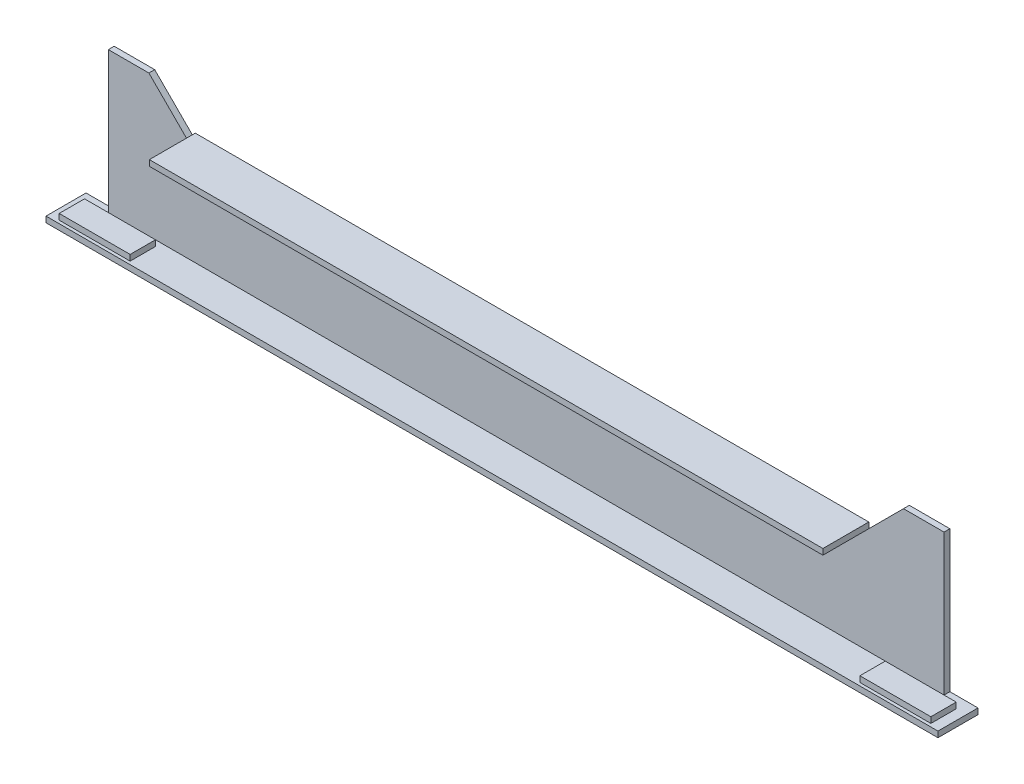
ISO-10303-21;
HEADER;
FILE_DESCRIPTION(('STEP AP214'),'2;1');
FILE_NAME('part.step','',(''),(''),'','','');
FILE_SCHEMA(('AUTOMOTIVE_DESIGN { 1 0 10303 214 1 1 1 1 }'));
ENDSEC;
DATA;
#1=APPLICATION_CONTEXT('core data for automotive mechanical design processes');
#2=APPLICATION_PROTOCOL_DEFINITION('international standard','automotive_design',2000,#1);
#3=PRODUCT_CONTEXT('',#1,'mechanical');
#4=PRODUCT('Part','Part','',(#3));
#5=PRODUCT_RELATED_PRODUCT_CATEGORY('part','',(#4));
#6=PRODUCT_DEFINITION_FORMATION('','',#4);
#7=PRODUCT_DEFINITION_CONTEXT('part definition',#1,'design');
#8=PRODUCT_DEFINITION('design','',#6,#7);
#9=PRODUCT_DEFINITION_SHAPE('','',#8);
#10=(LENGTH_UNIT() NAMED_UNIT(*) SI_UNIT(.MILLI.,.METRE.));
#11=(NAMED_UNIT(*) PLANE_ANGLE_UNIT() SI_UNIT($,.RADIAN.));
#12=(NAMED_UNIT(*) SI_UNIT($,.STERADIAN.) SOLID_ANGLE_UNIT());
#13=UNCERTAINTY_MEASURE_WITH_UNIT(LENGTH_MEASURE(1.E-05),#10,'distance_accuracy_value','');
#14=(GEOMETRIC_REPRESENTATION_CONTEXT(3) GLOBAL_UNCERTAINTY_ASSIGNED_CONTEXT((#13)) GLOBAL_UNIT_ASSIGNED_CONTEXT((#10,
#11,#12)) REPRESENTATION_CONTEXT('',''));
#15=CARTESIAN_POINT('',(0.,0.,0.));
#16=DIRECTION('',(0.,0.,1.));
#17=DIRECTION('',(1.,0.,0.));
#18=AXIS2_PLACEMENT_3D('',#15,#16,#17);
#19=CARTESIAN_POINT('',(880.,-139.25,79.));
#20=DIRECTION('',(0.,-1.,0.));
#21=DIRECTION('',(1.,0.,0.));
#22=AXIS2_PLACEMENT_3D('',#19,#20,#21);
#23=PLANE('',#22);
#24=DIRECTION('',(0.,0.,1.));
#25=VECTOR('',#24,1.);
#26=CARTESIAN_POINT('',(720.,-139.25,23.));
#27=LINE('',#26,#25);
#28=CARTESIAN_POINT('',(720.,-139.25,23.));
#29=VERTEX_POINT('',#28);
#30=CARTESIAN_POINT('',(720.,-139.25,73.));
#31=VERTEX_POINT('',#30);
#32=EDGE_CURVE('E214',#29,#31,#27,.T.);
#33=ORIENTED_EDGE('',*,*,#32,.F.);
#34=DIRECTION('',(-1.,0.,0.));
#35=VECTOR('',#34,1.);
#36=CARTESIAN_POINT('',(720.,-139.25,23.));
#37=LINE('',#36,#35);
#38=CARTESIAN_POINT('',(860.,-139.25,23.));
#39=VERTEX_POINT('',#38);
#40=EDGE_CURVE('E227',#39,#29,#37,.T.);
#41=ORIENTED_EDGE('',*,*,#40,.F.);
#42=DIRECTION('',(0.,0.,-1.));
#43=VECTOR('',#42,1.);
#44=CARTESIAN_POINT('',(860.,-139.25,23.));
#45=LINE('',#44,#43);
#46=CARTESIAN_POINT('',(860.,-139.25,73.));
#47=VERTEX_POINT('',#46);
#48=EDGE_CURVE('E236',#47,#39,#45,.T.);
#49=ORIENTED_EDGE('',*,*,#48,.F.);
#50=DIRECTION('',(1.,0.,0.));
#51=VECTOR('',#50,1.);
#52=CARTESIAN_POINT('',(720.,-139.25,73.));
#53=LINE('',#52,#51);
#54=EDGE_CURVE('E217',#31,#47,#53,.T.);
#55=ORIENTED_EDGE('',*,*,#54,.F.);
#56=EDGE_LOOP('',(#33,#41,#49,#55));
#57=FACE_BOUND('',#56,.T.);
#58=DIRECTION('',(0.,0.,-1.));
#59=VECTOR('',#58,1.);
#60=CARTESIAN_POINT('',(824.5,-139.25,11.5));
#61=LINE('',#60,#59);
#62=CARTESIAN_POINT('',(824.5,-139.25,11.5));
#63=VERTEX_POINT('',#62);
#64=CARTESIAN_POINT('',(824.5,-139.25,0.));
#65=VERTEX_POINT('',#64);
#66=EDGE_CURVE('E45',#63,#65,#61,.T.);
#67=ORIENTED_EDGE('',*,*,#66,.F.);
#68=DIRECTION('',(1.,0.,0.));
#69=VECTOR('',#68,1.);
#70=CARTESIAN_POINT('',(-824.5,-139.25,11.5));
#71=LINE('',#70,#69);
#72=CARTESIAN_POINT('',(-824.5,-139.25,11.5));
#73=VERTEX_POINT('',#72);
#74=EDGE_CURVE('E381',#73,#63,#71,.T.);
#75=ORIENTED_EDGE('',*,*,#74,.F.);
#76=DIRECTION('',(0.,0.,-1.));
#77=VECTOR('',#76,1.);
#78=CARTESIAN_POINT('',(-824.5,-139.25,11.5));
#79=LINE('',#78,#77);
#80=CARTESIAN_POINT('',(-824.5,-139.25,0.));
#81=VERTEX_POINT('',#80);
#82=EDGE_CURVE('E11',#73,#81,#79,.T.);
#83=ORIENTED_EDGE('',*,*,#82,.T.);
#84=DIRECTION('',(-1.,0.,0.));
#85=VECTOR('',#84,1.);
#86=CARTESIAN_POINT('',(880.,-139.25,0.));
#87=LINE('',#86,#85);
#88=CARTESIAN_POINT('',(-880.,-139.25,0.));
#89=VERTEX_POINT('',#88);
#90=EDGE_CURVE('E255',#81,#89,#87,.T.);
#91=ORIENTED_EDGE('',*,*,#90,.T.);
#92=DIRECTION('',(0.,0.,-1.));
#93=VECTOR('',#92,1.);
#94=CARTESIAN_POINT('',(-880.,-139.25,79.));
#95=LINE('',#94,#93);
#96=CARTESIAN_POINT('',(-880.,-139.25,79.));
#97=VERTEX_POINT('',#96);
#98=EDGE_CURVE('E270',#97,#89,#95,.T.);
#99=ORIENTED_EDGE('',*,*,#98,.F.);
#100=DIRECTION('',(-1.,0.,0.));
#101=VECTOR('',#100,1.);
#102=CARTESIAN_POINT('',(880.,-139.25,79.));
#103=LINE('',#102,#101);
#104=CARTESIAN_POINT('',(880.,-139.25,79.));
#105=VERTEX_POINT('',#104);
#106=EDGE_CURVE('E281',#105,#97,#103,.T.);
#107=ORIENTED_EDGE('',*,*,#106,.F.);
#108=DIRECTION('',(0.,0.,-1.));
#109=VECTOR('',#108,1.);
#110=CARTESIAN_POINT('',(880.,-139.25,79.));
#111=LINE('',#110,#109);
#112=CARTESIAN_POINT('',(880.,-139.25,0.));
#113=VERTEX_POINT('',#112);
#114=EDGE_CURVE('E267',#105,#113,#111,.T.);
#115=ORIENTED_EDGE('',*,*,#114,.T.);
#116=EDGE_CURVE('E264',#113,#65,#87,.T.);
#117=ORIENTED_EDGE('',*,*,#116,.T.);
#118=EDGE_LOOP('',(#67,#75,#83,#91,#99,#107,#115,#117));
#119=FACE_BOUND('',#118,.T.);
#120=DIRECTION('',(0.,0.,-1.));
#121=VECTOR('',#120,1.);
#122=CARTESIAN_POINT('',(-720.,-139.25,23.));
#123=LINE('',#122,#121);
#124=CARTESIAN_POINT('',(-720.,-139.25,73.));
#125=VERTEX_POINT('',#124);
#126=CARTESIAN_POINT('',(-720.,-139.25,23.));
#127=VERTEX_POINT('',#126);
#128=EDGE_CURVE('E213',#125,#127,#123,.T.);
#129=ORIENTED_EDGE('',*,*,#128,.F.);
#130=DIRECTION('',(1.,0.,0.));
#131=VECTOR('',#130,1.);
#132=CARTESIAN_POINT('',(-720.,-139.25,73.));
#133=LINE('',#132,#131);
#134=CARTESIAN_POINT('',(-860.,-139.25,73.));
#135=VERTEX_POINT('',#134);
#136=EDGE_CURVE('E210',#135,#125,#133,.T.);
#137=ORIENTED_EDGE('',*,*,#136,.F.);
#138=DIRECTION('',(0.,0.,1.));
#139=VECTOR('',#138,1.);
#140=CARTESIAN_POINT('',(-860.,-139.25,23.));
#141=LINE('',#140,#139);
#142=CARTESIAN_POINT('',(-860.,-139.25,23.));
#143=VERTEX_POINT('',#142);
#144=EDGE_CURVE('E58',#143,#135,#141,.T.);
#145=ORIENTED_EDGE('',*,*,#144,.F.);
#146=DIRECTION('',(-1.,0.,0.));
#147=VECTOR('',#146,1.);
#148=CARTESIAN_POINT('',(-720.,-139.25,23.));
#149=LINE('',#148,#147);
#150=EDGE_CURVE('E53',#127,#143,#149,.T.);
#151=ORIENTED_EDGE('',*,*,#150,.F.);
#152=EDGE_LOOP('',(#129,#137,#145,#151));
#153=FACE_BOUND('',#152,.T.);
#154=ADVANCED_FACE('F36',(#57,#119,#153),#23,.F.);
#155=CARTESIAN_POINT('',(-824.5,59.2499999999996,11.5));
#156=DIRECTION('',(0.,0.,1.));
#157=DIRECTION('',(1.,0.,0.));
#158=AXIS2_PLACEMENT_3D('',#155,#156,#157);
#159=PLANE('',#158);
#160=DIRECTION('',(0.,-1.,0.));
#161=VECTOR('',#160,1.);
#162=CARTESIAN_POINT('',(-824.5,139.25,11.5));
#163=LINE('',#162,#161);
#164=CARTESIAN_POINT('',(-824.5,139.25,11.5));
#165=VERTEX_POINT('',#164);
#166=EDGE_CURVE('E361',#165,#73,#163,.T.);
#167=ORIENTED_EDGE('',*,*,#166,.T.);
#168=ORIENTED_EDGE('',*,*,#74,.T.);
#169=DIRECTION('',(0.,1.,0.));
#170=VECTOR('',#169,1.);
#171=CARTESIAN_POINT('',(824.5,139.25,11.5));
#172=LINE('',#171,#170);
#173=CARTESIAN_POINT('',(824.5,139.25,11.5));
#174=VERTEX_POINT('',#173);
#175=EDGE_CURVE('E379',#63,#174,#172,.T.);
#176=ORIENTED_EDGE('',*,*,#175,.T.);
#177=DIRECTION('',(-1.,0.,0.));
#178=VECTOR('',#177,1.);
#179=CARTESIAN_POINT('',(744.5,139.25,11.5));
#180=LINE('',#179,#178);
#181=CARTESIAN_POINT('',(744.5,139.25,11.5));
#182=VERTEX_POINT('',#181);
#183=EDGE_CURVE('E377',#174,#182,#180,.T.);
#184=ORIENTED_EDGE('',*,*,#183,.T.);
#185=DIRECTION('',(-0.707106781186546,-0.707106781186549,0.));
#186=VECTOR('',#185,1.);
#187=CARTESIAN_POINT('',(744.5,139.25,11.5));
#188=LINE('',#187,#186);
#189=CARTESIAN_POINT('',(664.5,59.2499999999996,11.5));
#190=VERTEX_POINT('',#189);
#191=EDGE_CURVE('E374',#182,#190,#188,.T.);
#192=ORIENTED_EDGE('',*,*,#191,.T.);
#193=DIRECTION('',(-1.,0.,0.));
#194=VECTOR('',#193,1.);
#195=CARTESIAN_POINT('',(-664.5,59.2499999999996,11.5));
#196=LINE('',#195,#194);
#197=CARTESIAN_POINT('',(-664.5,59.2499999999996,11.5));
#198=VERTEX_POINT('',#197);
#199=EDGE_CURVE('E371',#190,#198,#196,.T.);
#200=ORIENTED_EDGE('',*,*,#199,.T.);
#201=DIRECTION('',(-0.707106781186547,0.707106781186548,0.));
#202=VECTOR('',#201,1.);
#203=CARTESIAN_POINT('',(-744.5,139.25,11.5));
#204=LINE('',#203,#202);
#205=CARTESIAN_POINT('',(-744.5,139.25,11.5));
#206=VERTEX_POINT('',#205);
#207=EDGE_CURVE('E369',#198,#206,#204,.T.);
#208=ORIENTED_EDGE('',*,*,#207,.T.);
#209=DIRECTION('',(-1.,0.,0.));
#210=VECTOR('',#209,1.);
#211=CARTESIAN_POINT('',(-824.5,139.25,11.5));
#212=LINE('',#211,#210);
#213=EDGE_CURVE('E359',#206,#165,#212,.T.);
#214=ORIENTED_EDGE('',*,*,#213,.T.);
#215=EDGE_LOOP('',(#167,#168,#176,#184,#192,#200,#208,#214));
#216=FACE_BOUND('',#215,.T.);
#217=ADVANCED_FACE('F417',(#216),#159,.T.);
#218=CARTESIAN_POINT('',(-824.5,59.2499999999996,0.));
#219=DIRECTION('',(0.,0.,1.));
#220=DIRECTION('',(1.,0.,0.));
#221=AXIS2_PLACEMENT_3D('',#218,#219,#220);
#222=PLANE('',#221);
#223=ORIENTED_EDGE('',*,*,#90,.F.);
#224=DIRECTION('',(0.,-1.,0.));
#225=VECTOR('',#224,1.);
#226=CARTESIAN_POINT('',(-824.5,139.25,0.));
#227=LINE('',#226,#225);
#228=CARTESIAN_POINT('',(-824.5,139.25,0.));
#229=VERTEX_POINT('',#228);
#230=EDGE_CURVE('E317',#229,#81,#227,.T.);
#231=ORIENTED_EDGE('',*,*,#230,.F.);
#232=DIRECTION('',(-1.,0.,0.));
#233=VECTOR('',#232,1.);
#234=CARTESIAN_POINT('',(-824.5,139.25,0.));
#235=LINE('',#234,#233);
#236=CARTESIAN_POINT('',(-744.5,139.25,0.));
#237=VERTEX_POINT('',#236);
#238=EDGE_CURVE('E319',#237,#229,#235,.T.);
#239=ORIENTED_EDGE('',*,*,#238,.F.);
#240=DIRECTION('',(-0.707106781186547,0.707106781186548,0.));
#241=VECTOR('',#240,1.);
#242=CARTESIAN_POINT('',(-744.5,139.25,0.));
#243=LINE('',#242,#241);
#244=CARTESIAN_POINT('',(-664.5,59.2499999999996,0.));
#245=VERTEX_POINT('',#244);
#246=EDGE_CURVE('E362',#245,#237,#243,.T.);
#247=ORIENTED_EDGE('',*,*,#246,.F.);
#248=DIRECTION('',(0.,-1.,0.));
#249=VECTOR('',#248,1.);
#250=CARTESIAN_POINT('',(-664.5,59.2499999999996,0.));
#251=LINE('',#250,#249);
#252=CARTESIAN_POINT('',(-664.5,70.7499999999995,0.));
#253=VERTEX_POINT('',#252);
#254=EDGE_CURVE('E269',#253,#245,#251,.T.);
#255=ORIENTED_EDGE('',*,*,#254,.F.);
#256=DIRECTION('',(-1.,0.,0.));
#257=VECTOR('',#256,1.);
#258=CARTESIAN_POINT('',(-664.5,70.7499999999995,0.));
#259=LINE('',#258,#257);
#260=CARTESIAN_POINT('',(664.5,70.7499999999995,0.));
#261=VERTEX_POINT('',#260);
#262=EDGE_CURVE('E399',#261,#253,#259,.T.);
#263=ORIENTED_EDGE('',*,*,#262,.F.);
#264=DIRECTION('',(0.,1.,0.));
#265=VECTOR('',#264,1.);
#266=CARTESIAN_POINT('',(664.5,59.2499999999996,0.));
#267=LINE('',#266,#265);
#268=CARTESIAN_POINT('',(664.5,59.2499999999996,0.));
#269=VERTEX_POINT('',#268);
#270=EDGE_CURVE('E402',#269,#261,#267,.T.);
#271=ORIENTED_EDGE('',*,*,#270,.F.);
#272=DIRECTION('',(-0.707106781186546,-0.707106781186549,0.));
#273=VECTOR('',#272,1.);
#274=CARTESIAN_POINT('',(744.5,139.25,0.));
#275=LINE('',#274,#273);
#276=CARTESIAN_POINT('',(744.5,139.25,0.));
#277=VERTEX_POINT('',#276);
#278=EDGE_CURVE('E364',#277,#269,#275,.T.);
#279=ORIENTED_EDGE('',*,*,#278,.F.);
#280=DIRECTION('',(-1.,0.,0.));
#281=VECTOR('',#280,1.);
#282=CARTESIAN_POINT('',(744.5,139.25,0.));
#283=LINE('',#282,#281);
#284=CARTESIAN_POINT('',(824.5,139.25,0.));
#285=VERTEX_POINT('',#284);
#286=EDGE_CURVE('E325',#285,#277,#283,.T.);
#287=ORIENTED_EDGE('',*,*,#286,.F.);
#288=DIRECTION('',(0.,1.,0.));
#289=VECTOR('',#288,1.);
#290=CARTESIAN_POINT('',(824.5,139.25,0.));
#291=LINE('',#290,#289);
#292=EDGE_CURVE('E322',#65,#285,#291,.T.);
#293=ORIENTED_EDGE('',*,*,#292,.F.);
#294=ORIENTED_EDGE('',*,*,#116,.F.);
#295=DIRECTION('',(0.,1.,0.));
#296=VECTOR('',#295,1.);
#297=CARTESIAN_POINT('',(880.,-139.25,0.));
#298=LINE('',#297,#296);
#299=CARTESIAN_POINT('',(880.,-150.75,0.));
#300=VERTEX_POINT('',#299);
#301=EDGE_CURVE('E252',#300,#113,#298,.T.);
#302=ORIENTED_EDGE('',*,*,#301,.F.);
#303=DIRECTION('',(1.,0.,0.));
#304=VECTOR('',#303,1.);
#305=CARTESIAN_POINT('',(880.,-150.75,0.));
#306=LINE('',#305,#304);
#307=CARTESIAN_POINT('',(-880.,-150.75,0.));
#308=VERTEX_POINT('',#307);
#309=EDGE_CURVE('E285',#308,#300,#306,.T.);
#310=ORIENTED_EDGE('',*,*,#309,.F.);
#311=DIRECTION('',(0.,-1.,0.));
#312=VECTOR('',#311,1.);
#313=CARTESIAN_POINT('',(-880.,-139.25,0.));
#314=LINE('',#313,#312);
#315=EDGE_CURVE('E258',#89,#308,#314,.T.);
#316=ORIENTED_EDGE('',*,*,#315,.F.);
#317=EDGE_LOOP('',(#223,#231,#239,#247,#255,#263,#271,#279,#287,#293,#294,#302,#310,#316));
#318=FACE_BOUND('',#317,.T.);
#319=ADVANCED_FACE('F301',(#318),#222,.F.);
#320=CARTESIAN_POINT('',(-824.5,139.25,11.5));
#321=DIRECTION('',(1.,0.,0.));
#322=DIRECTION('',(0.,0.,-1.));
#323=AXIS2_PLACEMENT_3D('',#320,#321,#322);
#324=PLANE('',#323);
#325=ORIENTED_EDGE('',*,*,#230,.T.);
#326=ORIENTED_EDGE('',*,*,#82,.F.);
#327=ORIENTED_EDGE('',*,*,#166,.F.);
#328=DIRECTION('',(0.,0.,-1.));
#329=VECTOR('',#328,1.);
#330=CARTESIAN_POINT('',(-824.5,139.25,11.5));
#331=LINE('',#330,#329);
#332=EDGE_CURVE('E357',#165,#229,#331,.T.);
#333=ORIENTED_EDGE('',*,*,#332,.T.);
#334=EDGE_LOOP('',(#325,#326,#327,#333));
#335=FACE_BOUND('',#334,.T.);
#336=ADVANCED_FACE('F38',(#335),#324,.F.);
#337=CARTESIAN_POINT('',(824.5,139.25,11.5));
#338=DIRECTION('',(-1.,0.,0.));
#339=DIRECTION('',(0.,0.,1.));
#340=AXIS2_PLACEMENT_3D('',#337,#338,#339);
#341=PLANE('',#340);
#342=ORIENTED_EDGE('',*,*,#292,.T.);
#343=DIRECTION('',(0.,0.,-1.));
#344=VECTOR('',#343,1.);
#345=CARTESIAN_POINT('',(824.5,139.25,11.5));
#346=LINE('',#345,#344);
#347=EDGE_CURVE('E336',#174,#285,#346,.T.);
#348=ORIENTED_EDGE('',*,*,#347,.F.);
#349=ORIENTED_EDGE('',*,*,#175,.F.);
#350=ORIENTED_EDGE('',*,*,#66,.T.);
#351=EDGE_LOOP('',(#342,#348,#349,#350));
#352=FACE_BOUND('',#351,.T.);
#353=ADVANCED_FACE('F440',(#352),#341,.F.);
#354=CARTESIAN_POINT('',(744.5,139.25,11.5));
#355=DIRECTION('',(0.,-1.,0.));
#356=DIRECTION('',(1.,0.,0.));
#357=AXIS2_PLACEMENT_3D('',#354,#355,#356);
#358=PLANE('',#357);
#359=ORIENTED_EDGE('',*,*,#286,.T.);
#360=DIRECTION('',(0.,0.,-1.));
#361=VECTOR('',#360,1.);
#362=CARTESIAN_POINT('',(744.5,139.25,11.5));
#363=LINE('',#362,#361);
#364=EDGE_CURVE('E341',#182,#277,#363,.T.);
#365=ORIENTED_EDGE('',*,*,#364,.F.);
#366=ORIENTED_EDGE('',*,*,#183,.F.);
#367=ORIENTED_EDGE('',*,*,#347,.T.);
#368=EDGE_LOOP('',(#359,#365,#366,#367));
#369=FACE_BOUND('',#368,.T.);
#370=ADVANCED_FACE('F438',(#369),#358,.F.);
#371=CARTESIAN_POINT('',(744.5,139.25,11.5));
#372=DIRECTION('',(0.707106781186549,-0.707106781186546,0.));
#373=DIRECTION('',(0.707106781186546,0.707106781186549,0.));
#374=AXIS2_PLACEMENT_3D('',#371,#372,#373);
#375=PLANE('',#374);
#376=ORIENTED_EDGE('',*,*,#278,.T.);
#377=DIRECTION('',(0.,0.,-1.));
#378=VECTOR('',#377,1.);
#379=CARTESIAN_POINT('',(664.5,59.2499999999996,11.5));
#380=LINE('',#379,#378);
#381=EDGE_CURVE('E347',#190,#269,#380,.T.);
#382=ORIENTED_EDGE('',*,*,#381,.F.);
#383=ORIENTED_EDGE('',*,*,#191,.F.);
#384=ORIENTED_EDGE('',*,*,#364,.T.);
#385=EDGE_LOOP('',(#376,#382,#383,#384));
#386=FACE_BOUND('',#385,.T.);
#387=ADVANCED_FACE('F436',(#386),#375,.F.);
#388=CARTESIAN_POINT('',(-744.5,139.25,11.5));
#389=DIRECTION('',(-0.707106781186548,-0.707106781186547,0.));
#390=DIRECTION('',(0.707106781186547,-0.707106781186548,0.));
#391=AXIS2_PLACEMENT_3D('',#388,#389,#390);
#392=PLANE('',#391);
#393=ORIENTED_EDGE('',*,*,#246,.T.);
#394=DIRECTION('',(0.,0.,-1.));
#395=VECTOR('',#394,1.);
#396=CARTESIAN_POINT('',(-744.5,139.25,11.5));
#397=LINE('',#396,#395);
#398=EDGE_CURVE('E354',#206,#237,#397,.T.);
#399=ORIENTED_EDGE('',*,*,#398,.F.);
#400=ORIENTED_EDGE('',*,*,#207,.F.);
#401=DIRECTION('',(0.,0.,-1.));
#402=VECTOR('',#401,1.);
#403=CARTESIAN_POINT('',(-664.5,59.2499999999996,11.5));
#404=LINE('',#403,#402);
#405=EDGE_CURVE('E351',#198,#245,#404,.T.);
#406=ORIENTED_EDGE('',*,*,#405,.T.);
#407=EDGE_LOOP('',(#393,#399,#400,#406));
#408=FACE_BOUND('',#407,.T.);
#409=ADVANCED_FACE('F413',(#408),#392,.F.);
#410=CARTESIAN_POINT('',(-824.5,139.25,11.5));
#411=DIRECTION('',(0.,-1.,0.));
#412=DIRECTION('',(1.,0.,0.));
#413=AXIS2_PLACEMENT_3D('',#410,#411,#412);
#414=PLANE('',#413);
#415=ORIENTED_EDGE('',*,*,#238,.T.);
#416=ORIENTED_EDGE('',*,*,#332,.F.);
#417=ORIENTED_EDGE('',*,*,#213,.F.);
#418=ORIENTED_EDGE('',*,*,#398,.T.);
#419=EDGE_LOOP('',(#415,#416,#417,#418));
#420=FACE_BOUND('',#419,.T.);
#421=ADVANCED_FACE('F468',(#420),#414,.F.);
#422=CARTESIAN_POINT('',(-664.5,59.2499999999996,90.5));
#423=DIRECTION('',(1.,0.,0.));
#424=DIRECTION('',(0.,0.,-1.));
#425=AXIS2_PLACEMENT_3D('',#422,#423,#424);
#426=PLANE('',#425);
#427=DIRECTION('',(0.,0.,-1.));
#428=VECTOR('',#427,1.);
#429=CARTESIAN_POINT('',(-664.5,70.7499999999995,90.5));
#430=LINE('',#429,#428);
#431=CARTESIAN_POINT('',(-664.5,70.7499999999995,90.5));
#432=VERTEX_POINT('',#431);
#433=EDGE_CURVE('E388',#432,#253,#430,.T.);
#434=ORIENTED_EDGE('',*,*,#433,.T.);
#435=ORIENTED_EDGE('',*,*,#254,.T.);
#436=ORIENTED_EDGE('',*,*,#405,.F.);
#437=DIRECTION('',(0.,0.,-1.));
#438=VECTOR('',#437,1.);
#439=CARTESIAN_POINT('',(-664.5,59.2499999999996,90.5));
#440=LINE('',#439,#438);
#441=CARTESIAN_POINT('',(-664.5,59.2499999999996,90.5));
#442=VERTEX_POINT('',#441);
#443=EDGE_CURVE('E323',#442,#198,#440,.T.);
#444=ORIENTED_EDGE('',*,*,#443,.F.);
#445=DIRECTION('',(0.,-1.,0.));
#446=VECTOR('',#445,1.);
#447=CARTESIAN_POINT('',(-664.5,59.2499999999996,90.5));
#448=LINE('',#447,#446);
#449=EDGE_CURVE('E396',#432,#442,#448,.T.);
#450=ORIENTED_EDGE('',*,*,#449,.F.);
#451=EDGE_LOOP('',(#434,#435,#436,#444,#450));
#452=FACE_BOUND('',#451,.T.);
#453=ADVANCED_FACE('F406',(#452),#426,.F.);
#454=CARTESIAN_POINT('',(-664.5,59.2499999999996,90.5));
#455=DIRECTION('',(0.,1.,0.));
#456=DIRECTION('',(0.,0.,1.));
#457=AXIS2_PLACEMENT_3D('',#454,#455,#456);
#458=PLANE('',#457);
#459=ORIENTED_EDGE('',*,*,#199,.F.);
#460=DIRECTION('',(0.,0.,-1.));
#461=VECTOR('',#460,1.);
#462=CARTESIAN_POINT('',(664.5,59.2499999999996,90.5));
#463=LINE('',#462,#461);
#464=CARTESIAN_POINT('',(664.5,59.2499999999996,90.5));
#465=VERTEX_POINT('',#464);
#466=EDGE_CURVE('E327',#465,#190,#463,.T.);
#467=ORIENTED_EDGE('',*,*,#466,.F.);
#468=DIRECTION('',(1.,0.,0.));
#469=VECTOR('',#468,1.);
#470=CARTESIAN_POINT('',(-664.5,59.2499999999996,90.5));
#471=LINE('',#470,#469);
#472=EDGE_CURVE('E394',#442,#465,#471,.T.);
#473=ORIENTED_EDGE('',*,*,#472,.F.);
#474=ORIENTED_EDGE('',*,*,#443,.T.);
#475=EDGE_LOOP('',(#459,#467,#473,#474));
#476=FACE_BOUND('',#475,.T.);
#477=ADVANCED_FACE('F423',(#476),#458,.F.);
#478=CARTESIAN_POINT('',(664.5,59.2499999999996,90.5));
#479=DIRECTION('',(-1.,0.,0.));
#480=DIRECTION('',(0.,0.,1.));
#481=AXIS2_PLACEMENT_3D('',#478,#479,#480);
#482=PLANE('',#481);
#483=ORIENTED_EDGE('',*,*,#466,.T.);
#484=ORIENTED_EDGE('',*,*,#381,.T.);
#485=ORIENTED_EDGE('',*,*,#270,.T.);
#486=DIRECTION('',(0.,0.,-1.));
#487=VECTOR('',#486,1.);
#488=CARTESIAN_POINT('',(664.5,70.7499999999995,90.5));
#489=LINE('',#488,#487);
#490=CARTESIAN_POINT('',(664.5,70.7499999999995,90.5));
#491=VERTEX_POINT('',#490);
#492=EDGE_CURVE('E386',#491,#261,#489,.T.);
#493=ORIENTED_EDGE('',*,*,#492,.F.);
#494=DIRECTION('',(0.,1.,0.));
#495=VECTOR('',#494,1.);
#496=CARTESIAN_POINT('',(664.5,59.2499999999996,90.5));
#497=LINE('',#496,#495);
#498=EDGE_CURVE('E392',#465,#491,#497,.T.);
#499=ORIENTED_EDGE('',*,*,#498,.F.);
#500=EDGE_LOOP('',(#483,#484,#485,#493,#499));
#501=FACE_BOUND('',#500,.T.);
#502=ADVANCED_FACE('F426',(#501),#482,.F.);
#503=CARTESIAN_POINT('',(-664.5,70.7499999999995,90.5));
#504=DIRECTION('',(0.,-1.,0.));
#505=DIRECTION('',(0.,0.,-1.));
#506=AXIS2_PLACEMENT_3D('',#503,#504,#505);
#507=PLANE('',#506);
#508=ORIENTED_EDGE('',*,*,#492,.T.);
#509=ORIENTED_EDGE('',*,*,#262,.T.);
#510=ORIENTED_EDGE('',*,*,#433,.F.);
#511=DIRECTION('',(-1.,0.,0.));
#512=VECTOR('',#511,1.);
#513=CARTESIAN_POINT('',(-664.5,70.7499999999995,90.5));
#514=LINE('',#513,#512);
#515=EDGE_CURVE('E390',#491,#432,#514,.T.);
#516=ORIENTED_EDGE('',*,*,#515,.F.);
#517=EDGE_LOOP('',(#508,#509,#510,#516));
#518=FACE_BOUND('',#517,.T.);
#519=ADVANCED_FACE('F433',(#518),#507,.F.);
#520=CARTESIAN_POINT('',(-664.5,70.7499999999995,90.5));
#521=DIRECTION('',(0.,0.,-1.));
#522=DIRECTION('',(-1.,0.,0.));
#523=AXIS2_PLACEMENT_3D('',#520,#521,#522);
#524=PLANE('',#523);
#525=ORIENTED_EDGE('',*,*,#449,.T.);
#526=ORIENTED_EDGE('',*,*,#472,.T.);
#527=ORIENTED_EDGE('',*,*,#498,.T.);
#528=ORIENTED_EDGE('',*,*,#515,.T.);
#529=EDGE_LOOP('',(#525,#526,#527,#528));
#530=FACE_BOUND('',#529,.T.);
#531=ADVANCED_FACE('F431',(#530),#524,.F.);
#532=CARTESIAN_POINT('',(880.,-139.25,79.));
#533=DIRECTION('',(-1.,0.,0.));
#534=DIRECTION('',(0.,-1.,0.));
#535=AXIS2_PLACEMENT_3D('',#532,#533,#534);
#536=PLANE('',#535);
#537=DIRECTION('',(0.,0.,-1.));
#538=VECTOR('',#537,1.);
#539=CARTESIAN_POINT('',(880.,-150.75,79.));
#540=LINE('',#539,#538);
#541=CARTESIAN_POINT('',(880.,-150.75,79.));
#542=VERTEX_POINT('',#541);
#543=EDGE_CURVE('E275',#542,#300,#540,.T.);
#544=ORIENTED_EDGE('',*,*,#543,.T.);
#545=ORIENTED_EDGE('',*,*,#301,.T.);
#546=ORIENTED_EDGE('',*,*,#114,.F.);
#547=DIRECTION('',(0.,1.,0.));
#548=VECTOR('',#547,1.);
#549=CARTESIAN_POINT('',(880.,-139.25,79.));
#550=LINE('',#549,#548);
#551=EDGE_CURVE('E283',#542,#105,#550,.T.);
#552=ORIENTED_EDGE('',*,*,#551,.F.);
#553=EDGE_LOOP('',(#544,#545,#546,#552));
#554=FACE_BOUND('',#553,.T.);
#555=ADVANCED_FACE('F306',(#554),#536,.F.);
#556=CARTESIAN_POINT('',(-880.,-139.25,79.));
#557=DIRECTION('',(1.,0.,0.));
#558=DIRECTION('',(0.,1.,0.));
#559=AXIS2_PLACEMENT_3D('',#556,#557,#558);
#560=PLANE('',#559);
#561=ORIENTED_EDGE('',*,*,#98,.T.);
#562=ORIENTED_EDGE('',*,*,#315,.T.);
#563=DIRECTION('',(0.,0.,-1.));
#564=VECTOR('',#563,1.);
#565=CARTESIAN_POINT('',(-880.,-150.75,79.));
#566=LINE('',#565,#564);
#567=CARTESIAN_POINT('',(-880.,-150.75,79.));
#568=VERTEX_POINT('',#567);
#569=EDGE_CURVE('E273',#568,#308,#566,.T.);
#570=ORIENTED_EDGE('',*,*,#569,.F.);
#571=DIRECTION('',(0.,-1.,0.));
#572=VECTOR('',#571,1.);
#573=CARTESIAN_POINT('',(-880.,-139.25,79.));
#574=LINE('',#573,#572);
#575=EDGE_CURVE('E279',#97,#568,#574,.T.);
#576=ORIENTED_EDGE('',*,*,#575,.F.);
#577=EDGE_LOOP('',(#561,#562,#570,#576));
#578=FACE_BOUND('',#577,.T.);
#579=ADVANCED_FACE('F294',(#578),#560,.F.);
#580=CARTESIAN_POINT('',(880.,-150.75,79.));
#581=DIRECTION('',(0.,1.,0.));
#582=DIRECTION('',(-1.,0.,0.));
#583=AXIS2_PLACEMENT_3D('',#580,#581,#582);
#584=PLANE('',#583);
#585=ORIENTED_EDGE('',*,*,#569,.T.);
#586=ORIENTED_EDGE('',*,*,#309,.T.);
#587=ORIENTED_EDGE('',*,*,#543,.F.);
#588=DIRECTION('',(1.,0.,0.));
#589=VECTOR('',#588,1.);
#590=CARTESIAN_POINT('',(880.,-150.75,79.));
#591=LINE('',#590,#589);
#592=EDGE_CURVE('E277',#568,#542,#591,.T.);
#593=ORIENTED_EDGE('',*,*,#592,.F.);
#594=EDGE_LOOP('',(#585,#586,#587,#593));
#595=FACE_BOUND('',#594,.T.);
#596=ADVANCED_FACE('F308',(#595),#584,.F.);
#597=CARTESIAN_POINT('',(880.,-150.75,79.));
#598=DIRECTION('',(0.,0.,-1.));
#599=DIRECTION('',(-1.,0.,0.));
#600=AXIS2_PLACEMENT_3D('',#597,#598,#599);
#601=PLANE('',#600);
#602=ORIENTED_EDGE('',*,*,#551,.T.);
#603=ORIENTED_EDGE('',*,*,#106,.T.);
#604=ORIENTED_EDGE('',*,*,#575,.T.);
#605=ORIENTED_EDGE('',*,*,#592,.T.);
#606=EDGE_LOOP('',(#602,#603,#604,#605));
#607=FACE_BOUND('',#606,.T.);
#608=ADVANCED_FACE('F310',(#607),#601,.F.);
#609=CARTESIAN_POINT('',(720.,-127.75,23.));
#610=DIRECTION('',(1.,0.,0.));
#611=DIRECTION('',(0.,1.,0.));
#612=AXIS2_PLACEMENT_3D('',#609,#610,#611);
#613=PLANE('',#612);
#614=ORIENTED_EDGE('',*,*,#32,.T.);
#615=DIRECTION('',(0.,-1.,0.));
#616=VECTOR('',#615,1.);
#617=CARTESIAN_POINT('',(720.,-127.75,73.));
#618=LINE('',#617,#616);
#619=CARTESIAN_POINT('',(720.,-127.75,73.));
#620=VERTEX_POINT('',#619);
#621=EDGE_CURVE('E249',#620,#31,#618,.T.);
#622=ORIENTED_EDGE('',*,*,#621,.F.);
#623=DIRECTION('',(0.,0.,1.));
#624=VECTOR('',#623,1.);
#625=CARTESIAN_POINT('',(720.,-127.75,23.));
#626=LINE('',#625,#624);
#627=CARTESIAN_POINT('',(720.,-127.75,23.));
#628=VERTEX_POINT('',#627);
#629=EDGE_CURVE('E223',#628,#620,#626,.T.);
#630=ORIENTED_EDGE('',*,*,#629,.F.);
#631=DIRECTION('',(0.,-1.,0.));
#632=VECTOR('',#631,1.);
#633=CARTESIAN_POINT('',(720.,-127.75,23.));
#634=LINE('',#633,#632);
#635=EDGE_CURVE('E232',#628,#29,#634,.T.);
#636=ORIENTED_EDGE('',*,*,#635,.T.);
#637=EDGE_LOOP('',(#614,#622,#630,#636));
#638=FACE_BOUND('',#637,.T.);
#639=ADVANCED_FACE('F533',(#638),#613,.F.);
#640=CARTESIAN_POINT('',(720.,-127.75,73.));
#641=DIRECTION('',(0.,0.,-1.));
#642=DIRECTION('',(-1.,0.,0.));
#643=AXIS2_PLACEMENT_3D('',#640,#641,#642);
#644=PLANE('',#643);
#645=ORIENTED_EDGE('',*,*,#54,.T.);
#646=DIRECTION('',(0.,-1.,0.));
#647=VECTOR('',#646,1.);
#648=CARTESIAN_POINT('',(860.,-127.75,73.));
#649=LINE('',#648,#647);
#650=CARTESIAN_POINT('',(860.,-127.75,73.));
#651=VERTEX_POINT('',#650);
#652=EDGE_CURVE('E246',#651,#47,#649,.T.);
#653=ORIENTED_EDGE('',*,*,#652,.F.);
#654=DIRECTION('',(1.,0.,0.));
#655=VECTOR('',#654,1.);
#656=CARTESIAN_POINT('',(720.,-127.75,73.));
#657=LINE('',#656,#655);
#658=EDGE_CURVE('E226',#620,#651,#657,.T.);
#659=ORIENTED_EDGE('',*,*,#658,.F.);
#660=ORIENTED_EDGE('',*,*,#621,.T.);
#661=EDGE_LOOP('',(#645,#653,#659,#660));
#662=FACE_BOUND('',#661,.T.);
#663=ADVANCED_FACE('F540',(#662),#644,.F.);
#664=CARTESIAN_POINT('',(860.,-127.75,23.));
#665=DIRECTION('',(-1.,0.,0.));
#666=DIRECTION('',(0.,-1.,0.));
#667=AXIS2_PLACEMENT_3D('',#664,#665,#666);
#668=PLANE('',#667);
#669=ORIENTED_EDGE('',*,*,#48,.T.);
#670=DIRECTION('',(0.,-1.,0.));
#671=VECTOR('',#670,1.);
#672=CARTESIAN_POINT('',(860.,-127.75,23.));
#673=LINE('',#672,#671);
#674=CARTESIAN_POINT('',(860.,-127.75,23.));
#675=VERTEX_POINT('',#674);
#676=EDGE_CURVE('E243',#675,#39,#673,.T.);
#677=ORIENTED_EDGE('',*,*,#676,.F.);
#678=DIRECTION('',(0.,0.,-1.));
#679=VECTOR('',#678,1.);
#680=CARTESIAN_POINT('',(860.,-127.75,23.));
#681=LINE('',#680,#679);
#682=EDGE_CURVE('E229',#651,#675,#681,.T.);
#683=ORIENTED_EDGE('',*,*,#682,.F.);
#684=ORIENTED_EDGE('',*,*,#652,.T.);
#685=EDGE_LOOP('',(#669,#677,#683,#684));
#686=FACE_BOUND('',#685,.T.);
#687=ADVANCED_FACE('F548',(#686),#668,.F.);
#688=CARTESIAN_POINT('',(720.,-127.75,23.));
#689=DIRECTION('',(0.,0.,1.));
#690=DIRECTION('',(1.,0.,0.));
#691=AXIS2_PLACEMENT_3D('',#688,#689,#690);
#692=PLANE('',#691);
#693=ORIENTED_EDGE('',*,*,#40,.T.);
#694=ORIENTED_EDGE('',*,*,#635,.F.);
#695=DIRECTION('',(-1.,0.,0.));
#696=VECTOR('',#695,1.);
#697=CARTESIAN_POINT('',(720.,-127.75,23.));
#698=LINE('',#697,#696);
#699=EDGE_CURVE('E231',#675,#628,#698,.T.);
#700=ORIENTED_EDGE('',*,*,#699,.F.);
#701=ORIENTED_EDGE('',*,*,#676,.T.);
#702=EDGE_LOOP('',(#693,#694,#700,#701));
#703=FACE_BOUND('',#702,.T.);
#704=ADVANCED_FACE('F556',(#703),#692,.F.);
#705=CARTESIAN_POINT('',(720.,-127.75,23.));
#706=DIRECTION('',(0.,1.,0.));
#707=DIRECTION('',(-1.,0.,0.));
#708=AXIS2_PLACEMENT_3D('',#705,#706,#707);
#709=PLANE('',#708);
#710=ORIENTED_EDGE('',*,*,#629,.T.);
#711=ORIENTED_EDGE('',*,*,#658,.T.);
#712=ORIENTED_EDGE('',*,*,#682,.T.);
#713=ORIENTED_EDGE('',*,*,#699,.T.);
#714=EDGE_LOOP('',(#710,#711,#712,#713));
#715=FACE_BOUND('',#714,.T.);
#716=ADVANCED_FACE('F564',(#715),#709,.T.);
#717=CARTESIAN_POINT('',(-720.,-127.75,23.));
#718=DIRECTION('',(-1.,0.,0.));
#719=DIRECTION('',(0.,-1.,0.));
#720=AXIS2_PLACEMENT_3D('',#717,#718,#719);
#721=PLANE('',#720);
#722=ORIENTED_EDGE('',*,*,#128,.T.);
#723=DIRECTION('',(0.,-1.,0.));
#724=VECTOR('',#723,1.);
#725=CARTESIAN_POINT('',(-720.,-127.75,23.));
#726=LINE('',#725,#724);
#727=CARTESIAN_POINT('',(-720.,-127.75,23.));
#728=VERTEX_POINT('',#727);
#729=EDGE_CURVE('E194',#728,#127,#726,.T.);
#730=ORIENTED_EDGE('',*,*,#729,.F.);
#731=DIRECTION('',(0.,0.,-1.));
#732=VECTOR('',#731,1.);
#733=CARTESIAN_POINT('',(-720.,-127.75,23.));
#734=LINE('',#733,#732);
#735=CARTESIAN_POINT('',(-720.,-127.75,73.));
#736=VERTEX_POINT('',#735);
#737=EDGE_CURVE('E201',#736,#728,#734,.T.);
#738=ORIENTED_EDGE('',*,*,#737,.F.);
#739=DIRECTION('',(0.,-1.,0.));
#740=VECTOR('',#739,1.);
#741=CARTESIAN_POINT('',(-720.,-127.75,73.));
#742=LINE('',#741,#740);
#743=EDGE_CURVE('E706',#736,#125,#742,.T.);
#744=ORIENTED_EDGE('',*,*,#743,.T.);
#745=EDGE_LOOP('',(#722,#730,#738,#744));
#746=FACE_BOUND('',#745,.T.);
#747=ADVANCED_FACE('F212',(#746),#721,.F.);
#748=CARTESIAN_POINT('',(-720.,-127.75,23.));
#749=DIRECTION('',(0.,0.,1.));
#750=DIRECTION('',(1.,0.,0.));
#751=AXIS2_PLACEMENT_3D('',#748,#749,#750);
#752=PLANE('',#751);
#753=ORIENTED_EDGE('',*,*,#150,.T.);
#754=DIRECTION('',(0.,-1.,0.));
#755=VECTOR('',#754,1.);
#756=CARTESIAN_POINT('',(-860.,-127.75,23.));
#757=LINE('',#756,#755);
#758=CARTESIAN_POINT('',(-860.,-127.75,23.));
#759=VERTEX_POINT('',#758);
#760=EDGE_CURVE('E197',#759,#143,#757,.T.);
#761=ORIENTED_EDGE('',*,*,#760,.F.);
#762=DIRECTION('',(-1.,0.,0.));
#763=VECTOR('',#762,1.);
#764=CARTESIAN_POINT('',(-720.,-127.75,23.));
#765=LINE('',#764,#763);
#766=EDGE_CURVE('E190',#728,#759,#765,.T.);
#767=ORIENTED_EDGE('',*,*,#766,.F.);
#768=ORIENTED_EDGE('',*,*,#729,.T.);
#769=EDGE_LOOP('',(#753,#761,#767,#768));
#770=FACE_BOUND('',#769,.T.);
#771=ADVANCED_FACE('F192',(#770),#752,.F.);
#772=CARTESIAN_POINT('',(-860.,-127.75,23.));
#773=DIRECTION('',(1.,0.,0.));
#774=DIRECTION('',(0.,1.,0.));
#775=AXIS2_PLACEMENT_3D('',#772,#773,#774);
#776=PLANE('',#775);
#777=ORIENTED_EDGE('',*,*,#144,.T.);
#778=DIRECTION('',(0.,-1.,0.));
#779=VECTOR('',#778,1.);
#780=CARTESIAN_POINT('',(-860.,-127.75,73.));
#781=LINE('',#780,#779);
#782=CARTESIAN_POINT('',(-860.,-127.75,73.));
#783=VERTEX_POINT('',#782);
#784=EDGE_CURVE('E219',#783,#135,#781,.T.);
#785=ORIENTED_EDGE('',*,*,#784,.F.);
#786=DIRECTION('',(0.,0.,1.));
#787=VECTOR('',#786,1.);
#788=CARTESIAN_POINT('',(-860.,-127.75,23.));
#789=LINE('',#788,#787);
#790=EDGE_CURVE('E200',#759,#783,#789,.T.);
#791=ORIENTED_EDGE('',*,*,#790,.F.);
#792=ORIENTED_EDGE('',*,*,#760,.T.);
#793=EDGE_LOOP('',(#777,#785,#791,#792));
#794=FACE_BOUND('',#793,.T.);
#795=ADVANCED_FACE('F585',(#794),#776,.F.);
#796=CARTESIAN_POINT('',(-720.,-127.75,73.));
#797=DIRECTION('',(0.,0.,-1.));
#798=DIRECTION('',(-1.,0.,0.));
#799=AXIS2_PLACEMENT_3D('',#796,#797,#798);
#800=PLANE('',#799);
#801=ORIENTED_EDGE('',*,*,#136,.T.);
#802=ORIENTED_EDGE('',*,*,#743,.F.);
#803=DIRECTION('',(1.,0.,0.));
#804=VECTOR('',#803,1.);
#805=CARTESIAN_POINT('',(-720.,-127.75,73.));
#806=LINE('',#805,#804);
#807=EDGE_CURVE('E206',#783,#736,#806,.T.);
#808=ORIENTED_EDGE('',*,*,#807,.F.);
#809=ORIENTED_EDGE('',*,*,#784,.T.);
#810=EDGE_LOOP('',(#801,#802,#808,#809));
#811=FACE_BOUND('',#810,.T.);
#812=ADVANCED_FACE('F592',(#811),#800,.F.);
#813=CARTESIAN_POINT('',(-720.,-127.75,23.));
#814=DIRECTION('',(0.,-1.,0.));
#815=DIRECTION('',(1.,0.,0.));
#816=AXIS2_PLACEMENT_3D('',#813,#814,#815);
#817=PLANE('',#816);
#818=ORIENTED_EDGE('',*,*,#737,.T.);
#819=ORIENTED_EDGE('',*,*,#766,.T.);
#820=ORIENTED_EDGE('',*,*,#790,.T.);
#821=ORIENTED_EDGE('',*,*,#807,.T.);
#822=EDGE_LOOP('',(#818,#819,#820,#821));
#823=FACE_BOUND('',#822,.T.);
#824=ADVANCED_FACE('F204',(#823),#817,.F.);
#825=CLOSED_SHELL('',(#154,#217,#319,#336,#353,#370,#387,#409,#421,#453,#477,#502,#519,#531,
#555,#579,#596,#608,#639,#663,#687,#704,#716,#747,#771,#795,#812,#824));
#826=MANIFOLD_SOLID_BREP('B2',#825);
#827=ADVANCED_BREP_SHAPE_REPRESENTATION('',(#18,#826),#14);
#828=SHAPE_DEFINITION_REPRESENTATION(#9,#827);
ENDSEC;
END-ISO-10303-21;
